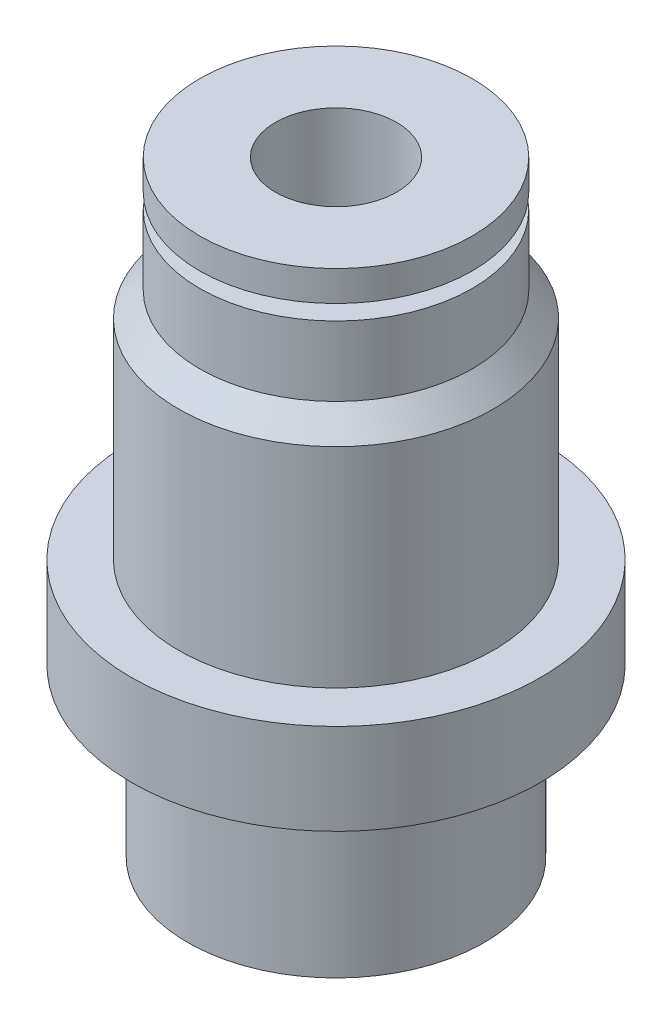
ISO-10303-21;
HEADER;
FILE_DESCRIPTION(('STEP AP214'),'2;1');
FILE_NAME('part.step','',(''),(''),'','','');
FILE_SCHEMA(('AUTOMOTIVE_DESIGN { 1 0 10303 214 1 1 1 1 }'));
ENDSEC;
DATA;
#1=APPLICATION_CONTEXT('core data for automotive mechanical design processes');
#2=APPLICATION_PROTOCOL_DEFINITION('international standard','automotive_design',2000,#1);
#3=PRODUCT_CONTEXT('',#1,'mechanical');
#4=PRODUCT('Part','Part','',(#3));
#5=PRODUCT_RELATED_PRODUCT_CATEGORY('part','',(#4));
#6=PRODUCT_DEFINITION_FORMATION('','',#4);
#7=PRODUCT_DEFINITION_CONTEXT('part definition',#1,'design');
#8=PRODUCT_DEFINITION('design','',#6,#7);
#9=PRODUCT_DEFINITION_SHAPE('','',#8);
#10=(LENGTH_UNIT() NAMED_UNIT(*) SI_UNIT(.MILLI.,.METRE.));
#11=(NAMED_UNIT(*) PLANE_ANGLE_UNIT() SI_UNIT($,.RADIAN.));
#12=(NAMED_UNIT(*) SI_UNIT($,.STERADIAN.) SOLID_ANGLE_UNIT());
#13=UNCERTAINTY_MEASURE_WITH_UNIT(LENGTH_MEASURE(1.E-05),#10,'distance_accuracy_value','');
#14=(GEOMETRIC_REPRESENTATION_CONTEXT(3) GLOBAL_UNCERTAINTY_ASSIGNED_CONTEXT((#13)) GLOBAL_UNIT_ASSIGNED_CONTEXT((#10,
#11,#12)) REPRESENTATION_CONTEXT('',''));
#15=CARTESIAN_POINT('',(0.,0.,0.));
#16=DIRECTION('',(0.,0.,1.));
#17=DIRECTION('',(1.,0.,0.));
#18=AXIS2_PLACEMENT_3D('',#15,#16,#17);
#19=CARTESIAN_POINT('',(0.,16.2,0.));
#20=DIRECTION('',(0.,-1.,0.));
#21=DIRECTION('',(0.,0.,-1.));
#22=AXIS2_PLACEMENT_3D('',#19,#20,#21);
#23=CONICAL_SURFACE('',#22,4.5,0.716099549960896);
#24=CARTESIAN_POINT('',(0.,15.4,0.));
#25=DIRECTION('',(0.,-1.,0.));
#26=DIRECTION('',(0.,0.,-1.));
#27=AXIS2_PLACEMENT_3D('',#24,#25,#26);
#28=CIRCLE('',#27,5.19615242270663);
#29=CARTESIAN_POINT('',(0.,15.4,-5.19615242270663));
#30=VERTEX_POINT('',#29);
#31=EDGE_CURVE('E92',#30,#30,#28,.T.);
#32=ORIENTED_EDGE('',*,*,#31,.F.);
#33=EDGE_LOOP('',(#32));
#34=FACE_BOUND('',#33,.T.);
#35=CARTESIAN_POINT('',(0.,16.2,0.));
#36=DIRECTION('',(0.,-1.,0.));
#37=DIRECTION('',(0.,0.,-1.));
#38=AXIS2_PLACEMENT_3D('',#35,#36,#37);
#39=CIRCLE('',#38,4.5);
#40=CARTESIAN_POINT('',(0.,16.2,-4.5));
#41=VERTEX_POINT('',#40);
#42=EDGE_CURVE('E10',#41,#41,#39,.T.);
#43=ORIENTED_EDGE('',*,*,#42,.T.);
#44=EDGE_LOOP('',(#43));
#45=FACE_BOUND('',#44,.T.);
#46=ADVANCED_FACE('F40',(#34,#45),#23,.T.);
#47=CARTESIAN_POINT('',(0.,0.,0.));
#48=DIRECTION('',(0.,-1.,0.));
#49=DIRECTION('',(0.,0.,-1.));
#50=AXIS2_PLACEMENT_3D('',#47,#48,#49);
#51=CYLINDRICAL_SURFACE('',#50,4.5);
#52=ORIENTED_EDGE('',*,*,#42,.F.);
#53=EDGE_LOOP('',(#52));
#54=FACE_BOUND('',#53,.T.);
#55=CARTESIAN_POINT('',(0.,18.5,0.));
#56=DIRECTION('',(0.,-1.,0.));
#57=DIRECTION('',(0.,0.,-1.));
#58=AXIS2_PLACEMENT_3D('',#55,#56,#57);
#59=CIRCLE('',#58,4.5);
#60=CARTESIAN_POINT('',(0.,18.5,-4.5));
#61=VERTEX_POINT('',#60);
#62=EDGE_CURVE('E46',#61,#61,#59,.T.);
#63=ORIENTED_EDGE('',*,*,#62,.T.);
#64=EDGE_LOOP('',(#63));
#65=FACE_BOUND('',#64,.T.);
#66=ADVANCED_FACE('F99',(#54,#65),#51,.T.);
#67=CARTESIAN_POINT('',(0.,18.5,0.));
#68=DIRECTION('',(0.,-1.,0.));
#69=DIRECTION('',(0.,0.,-1.));
#70=AXIS2_PLACEMENT_3D('',#67,#68,#69);
#71=PLANE('',#70);
#72=ORIENTED_EDGE('',*,*,#62,.F.);
#73=EDGE_LOOP('',(#72));
#74=FACE_BOUND('',#73,.T.);
#75=CARTESIAN_POINT('',(0.,18.5,0.));
#76=DIRECTION('',(0.,-1.,0.));
#77=DIRECTION('',(0.,0.,-1.));
#78=AXIS2_PLACEMENT_3D('',#75,#76,#77);
#79=CIRCLE('',#78,3.);
#80=CARTESIAN_POINT('',(0.,18.5,-3.));
#81=VERTEX_POINT('',#80);
#82=EDGE_CURVE('E50',#81,#81,#79,.T.);
#83=ORIENTED_EDGE('',*,*,#82,.T.);
#84=EDGE_LOOP('',(#83));
#85=FACE_BOUND('',#84,.T.);
#86=ADVANCED_FACE('F103',(#74,#85),#71,.F.);
#87=CARTESIAN_POINT('',(0.,0.,0.));
#88=DIRECTION('',(0.,-1.,0.));
#89=DIRECTION('',(0.,0.,-1.));
#90=AXIS2_PLACEMENT_3D('',#87,#88,#89);
#91=CYLINDRICAL_SURFACE('',#90,3.);
#92=ORIENTED_EDGE('',*,*,#82,.F.);
#93=EDGE_LOOP('',(#92));
#94=FACE_BOUND('',#93,.T.);
#95=CARTESIAN_POINT('',(0.,19.,0.));
#96=DIRECTION('',(0.,-1.,0.));
#97=DIRECTION('',(0.,0.,-1.));
#98=AXIS2_PLACEMENT_3D('',#95,#96,#97);
#99=CIRCLE('',#98,3.);
#100=CARTESIAN_POINT('',(0.,19.,-3.));
#101=VERTEX_POINT('',#100);
#102=EDGE_CURVE('E54',#101,#101,#99,.T.);
#103=ORIENTED_EDGE('',*,*,#102,.T.);
#104=EDGE_LOOP('',(#103));
#105=FACE_BOUND('',#104,.T.);
#106=ADVANCED_FACE('F108',(#94,#105),#91,.T.);
#107=CARTESIAN_POINT('',(0.,19.,0.));
#108=DIRECTION('',(0.,1.,0.));
#109=DIRECTION('',(0.,0.,1.));
#110=AXIS2_PLACEMENT_3D('',#107,#108,#109);
#111=PLANE('',#110);
#112=ORIENTED_EDGE('',*,*,#102,.F.);
#113=EDGE_LOOP('',(#112));
#114=FACE_BOUND('',#113,.T.);
#115=CARTESIAN_POINT('',(0.,19.,0.));
#116=DIRECTION('',(0.,-1.,0.));
#117=DIRECTION('',(0.,0.,-1.));
#118=AXIS2_PLACEMENT_3D('',#115,#116,#117);
#119=CIRCLE('',#118,4.5);
#120=CARTESIAN_POINT('',(0.,19.,-4.5));
#121=VERTEX_POINT('',#120);
#122=EDGE_CURVE('E59',#121,#121,#119,.T.);
#123=ORIENTED_EDGE('',*,*,#122,.T.);
#124=EDGE_LOOP('',(#123));
#125=FACE_BOUND('',#124,.T.);
#126=ADVANCED_FACE('F114',(#114,#125),#111,.F.);
#127=CARTESIAN_POINT('',(0.,0.,0.));
#128=DIRECTION('',(0.,-1.,0.));
#129=DIRECTION('',(0.,0.,-1.));
#130=AXIS2_PLACEMENT_3D('',#127,#128,#129);
#131=CYLINDRICAL_SURFACE('',#130,4.5);
#132=ORIENTED_EDGE('',*,*,#122,.F.);
#133=EDGE_LOOP('',(#132));
#134=FACE_BOUND('',#133,.T.);
#135=CARTESIAN_POINT('',(0.,20.,0.));
#136=DIRECTION('',(0.,-1.,0.));
#137=DIRECTION('',(0.,0.,-1.));
#138=AXIS2_PLACEMENT_3D('',#135,#136,#137);
#139=CIRCLE('',#138,4.5);
#140=CARTESIAN_POINT('',(0.,20.,-4.5));
#141=VERTEX_POINT('',#140);
#142=EDGE_CURVE('E62',#141,#141,#139,.T.);
#143=ORIENTED_EDGE('',*,*,#142,.T.);
#144=EDGE_LOOP('',(#143));
#145=FACE_BOUND('',#144,.T.);
#146=ADVANCED_FACE('F118',(#134,#145),#131,.T.);
#147=CARTESIAN_POINT('',(0.,20.,0.));
#148=DIRECTION('',(0.,-1.,0.));
#149=DIRECTION('',(0.,0.,-1.));
#150=AXIS2_PLACEMENT_3D('',#147,#148,#149);
#151=PLANE('',#150);
#152=ORIENTED_EDGE('',*,*,#142,.F.);
#153=EDGE_LOOP('',(#152));
#154=FACE_BOUND('',#153,.T.);
#155=CARTESIAN_POINT('',(0.,20.,0.));
#156=DIRECTION('',(0.,-1.,0.));
#157=DIRECTION('',(0.,0.,-1.));
#158=AXIS2_PLACEMENT_3D('',#155,#156,#157);
#159=CIRCLE('',#158,2.);
#160=CARTESIAN_POINT('',(0.,20.,-2.));
#161=VERTEX_POINT('',#160);
#162=EDGE_CURVE('E65',#161,#161,#159,.T.);
#163=ORIENTED_EDGE('',*,*,#162,.T.);
#164=EDGE_LOOP('',(#163));
#165=FACE_BOUND('',#164,.T.);
#166=ADVANCED_FACE('F122',(#154,#165),#151,.F.);
#167=CARTESIAN_POINT('',(0.,0.,0.));
#168=DIRECTION('',(0.,-1.,0.));
#169=DIRECTION('',(0.,0.,-1.));
#170=AXIS2_PLACEMENT_3D('',#167,#168,#169);
#171=CYLINDRICAL_SURFACE('',#170,2.);
#172=CARTESIAN_POINT('',(0.,5.5,0.));
#173=DIRECTION('',(0.,-1.,0.));
#174=DIRECTION('',(0.,0.,-1.));
#175=AXIS2_PLACEMENT_3D('',#172,#173,#174);
#176=CIRCLE('',#175,2.);
#177=CARTESIAN_POINT('',(0.,5.5,-2.));
#178=VERTEX_POINT('',#177);
#179=EDGE_CURVE('E68',#178,#178,#176,.T.);
#180=ORIENTED_EDGE('',*,*,#179,.T.);
#181=EDGE_LOOP('',(#180));
#182=FACE_BOUND('',#181,.T.);
#183=ORIENTED_EDGE('',*,*,#162,.F.);
#184=EDGE_LOOP('',(#183));
#185=FACE_BOUND('',#184,.T.);
#186=ADVANCED_FACE('F126',(#182,#185),#171,.F.);
#187=CARTESIAN_POINT('',(0.,5.5,0.));
#188=DIRECTION('',(0.,1.,0.));
#189=DIRECTION('',(0.,0.,1.));
#190=AXIS2_PLACEMENT_3D('',#187,#188,#189);
#191=PLANE('',#190);
#192=ORIENTED_EDGE('',*,*,#179,.F.);
#193=EDGE_LOOP('',(#192));
#194=FACE_BOUND('',#193,.T.);
#195=CARTESIAN_POINT('',(0.,5.5,0.));
#196=DIRECTION('',(0.,-1.,0.));
#197=DIRECTION('',(0.,0.,-1.));
#198=AXIS2_PLACEMENT_3D('',#195,#196,#197);
#199=CIRCLE('',#198,2.1);
#200=CARTESIAN_POINT('',(0.,5.5,-2.1));
#201=VERTEX_POINT('',#200);
#202=EDGE_CURVE('E71',#201,#201,#199,.T.);
#203=ORIENTED_EDGE('',*,*,#202,.T.);
#204=EDGE_LOOP('',(#203));
#205=FACE_BOUND('',#204,.T.);
#206=ADVANCED_FACE('F130',(#194,#205),#191,.F.);
#207=CARTESIAN_POINT('',(0.,0.,0.));
#208=DIRECTION('',(0.,-1.,0.));
#209=DIRECTION('',(0.,0.,-1.));
#210=AXIS2_PLACEMENT_3D('',#207,#208,#209);
#211=CYLINDRICAL_SURFACE('',#210,2.1);
#212=ORIENTED_EDGE('',*,*,#202,.F.);
#213=EDGE_LOOP('',(#212));
#214=FACE_BOUND('',#213,.T.);
#215=CARTESIAN_POINT('',(0.,0.,0.));
#216=DIRECTION('',(0.,-1.,0.));
#217=DIRECTION('',(0.,0.,-1.));
#218=AXIS2_PLACEMENT_3D('',#215,#216,#217);
#219=CIRCLE('',#218,2.1);
#220=CARTESIAN_POINT('',(0.,0.,-2.1));
#221=VERTEX_POINT('',#220);
#222=EDGE_CURVE('E74',#221,#221,#219,.T.);
#223=ORIENTED_EDGE('',*,*,#222,.T.);
#224=EDGE_LOOP('',(#223));
#225=FACE_BOUND('',#224,.T.);
#226=ADVANCED_FACE('F134',(#214,#225),#211,.F.);
#227=CARTESIAN_POINT('',(0.,0.,0.));
#228=DIRECTION('',(0.,1.,0.));
#229=DIRECTION('',(0.,0.,1.));
#230=AXIS2_PLACEMENT_3D('',#227,#228,#229);
#231=PLANE('',#230);
#232=ORIENTED_EDGE('',*,*,#222,.F.);
#233=EDGE_LOOP('',(#232));
#234=FACE_BOUND('',#233,.T.);
#235=CARTESIAN_POINT('',(0.,0.,0.));
#236=DIRECTION('',(0.,-1.,0.));
#237=DIRECTION('',(0.,0.,-1.));
#238=AXIS2_PLACEMENT_3D('',#235,#236,#237);
#239=CIRCLE('',#238,4.9);
#240=CARTESIAN_POINT('',(0.,0.,-4.9));
#241=VERTEX_POINT('',#240);
#242=EDGE_CURVE('E77',#241,#241,#239,.T.);
#243=ORIENTED_EDGE('',*,*,#242,.T.);
#244=EDGE_LOOP('',(#243));
#245=FACE_BOUND('',#244,.T.);
#246=ADVANCED_FACE('F138',(#234,#245),#231,.F.);
#247=CARTESIAN_POINT('',(0.,0.,0.));
#248=DIRECTION('',(0.,-1.,0.));
#249=DIRECTION('',(0.,0.,-1.));
#250=AXIS2_PLACEMENT_3D('',#247,#248,#249);
#251=CYLINDRICAL_SURFACE('',#250,4.9);
#252=ORIENTED_EDGE('',*,*,#242,.F.);
#253=EDGE_LOOP('',(#252));
#254=FACE_BOUND('',#253,.T.);
#255=CARTESIAN_POINT('',(0.,5.5,0.));
#256=DIRECTION('',(0.,-1.,0.));
#257=DIRECTION('',(0.,0.,-1.));
#258=AXIS2_PLACEMENT_3D('',#255,#256,#257);
#259=CIRCLE('',#258,4.9);
#260=CARTESIAN_POINT('',(0.,5.5,-4.9));
#261=VERTEX_POINT('',#260);
#262=EDGE_CURVE('E80',#261,#261,#259,.T.);
#263=ORIENTED_EDGE('',*,*,#262,.T.);
#264=EDGE_LOOP('',(#263));
#265=FACE_BOUND('',#264,.T.);
#266=ADVANCED_FACE('F142',(#254,#265),#251,.T.);
#267=CARTESIAN_POINT('',(0.,5.5,0.));
#268=DIRECTION('',(0.,1.,0.));
#269=DIRECTION('',(0.,0.,1.));
#270=AXIS2_PLACEMENT_3D('',#267,#268,#269);
#271=PLANE('',#270);
#272=ORIENTED_EDGE('',*,*,#262,.F.);
#273=EDGE_LOOP('',(#272));
#274=FACE_BOUND('',#273,.T.);
#275=CARTESIAN_POINT('',(0.,5.5,0.));
#276=DIRECTION('',(0.,-1.,0.));
#277=DIRECTION('',(0.,0.,-1.));
#278=AXIS2_PLACEMENT_3D('',#275,#276,#277);
#279=CIRCLE('',#278,6.75);
#280=CARTESIAN_POINT('',(0.,5.5,-6.75));
#281=VERTEX_POINT('',#280);
#282=EDGE_CURVE('E83',#281,#281,#279,.T.);
#283=ORIENTED_EDGE('',*,*,#282,.T.);
#284=EDGE_LOOP('',(#283));
#285=FACE_BOUND('',#284,.T.);
#286=ADVANCED_FACE('F146',(#274,#285),#271,.F.);
#287=CARTESIAN_POINT('',(0.,0.,0.));
#288=DIRECTION('',(0.,-1.,0.));
#289=DIRECTION('',(0.,0.,-1.));
#290=AXIS2_PLACEMENT_3D('',#287,#288,#289);
#291=CYLINDRICAL_SURFACE('',#290,6.75);
#292=ORIENTED_EDGE('',*,*,#282,.F.);
#293=EDGE_LOOP('',(#292));
#294=FACE_BOUND('',#293,.T.);
#295=CARTESIAN_POINT('',(0.,8.5,0.));
#296=DIRECTION('',(0.,-1.,0.));
#297=DIRECTION('',(0.,0.,-1.));
#298=AXIS2_PLACEMENT_3D('',#295,#296,#297);
#299=CIRCLE('',#298,6.75);
#300=CARTESIAN_POINT('',(0.,8.5,-6.75));
#301=VERTEX_POINT('',#300);
#302=EDGE_CURVE('E86',#301,#301,#299,.T.);
#303=ORIENTED_EDGE('',*,*,#302,.T.);
#304=EDGE_LOOP('',(#303));
#305=FACE_BOUND('',#304,.T.);
#306=ADVANCED_FACE('F150',(#294,#305),#291,.T.);
#307=CARTESIAN_POINT('',(0.,8.5,0.));
#308=DIRECTION('',(0.,-1.,0.));
#309=DIRECTION('',(0.,0.,-1.));
#310=AXIS2_PLACEMENT_3D('',#307,#308,#309);
#311=PLANE('',#310);
#312=ORIENTED_EDGE('',*,*,#302,.F.);
#313=EDGE_LOOP('',(#312));
#314=FACE_BOUND('',#313,.T.);
#315=CARTESIAN_POINT('',(0.,8.5,0.));
#316=DIRECTION('',(0.,-1.,0.));
#317=DIRECTION('',(0.,0.,-1.));
#318=AXIS2_PLACEMENT_3D('',#315,#316,#317);
#319=CIRCLE('',#318,5.19615242270663);
#320=CARTESIAN_POINT('',(0.,8.5,-5.19615242270663));
#321=VERTEX_POINT('',#320);
#322=EDGE_CURVE('E89',#321,#321,#319,.T.);
#323=ORIENTED_EDGE('',*,*,#322,.T.);
#324=EDGE_LOOP('',(#323));
#325=FACE_BOUND('',#324,.T.);
#326=ADVANCED_FACE('F154',(#314,#325),#311,.F.);
#327=CARTESIAN_POINT('',(0.,0.,0.));
#328=DIRECTION('',(0.,-1.,0.));
#329=DIRECTION('',(0.,0.,-1.));
#330=AXIS2_PLACEMENT_3D('',#327,#328,#329);
#331=CYLINDRICAL_SURFACE('',#330,5.19615242270663);
#332=ORIENTED_EDGE('',*,*,#322,.F.);
#333=EDGE_LOOP('',(#332));
#334=FACE_BOUND('',#333,.T.);
#335=ORIENTED_EDGE('',*,*,#31,.T.);
#336=EDGE_LOOP('',(#335));
#337=FACE_BOUND('',#336,.T.);
#338=ADVANCED_FACE('F96',(#334,#337),#331,.T.);
#339=CLOSED_SHELL('',(#46,#66,#86,#106,#126,#146,#166,#186,#206,#226,#246,#266,#286,#306,#326,#338));
#340=MANIFOLD_SOLID_BREP('B2',#339);
#341=ADVANCED_BREP_SHAPE_REPRESENTATION('',(#18,#340),#14);
#342=SHAPE_DEFINITION_REPRESENTATION(#9,#341);
ENDSEC;
END-ISO-10303-21;
